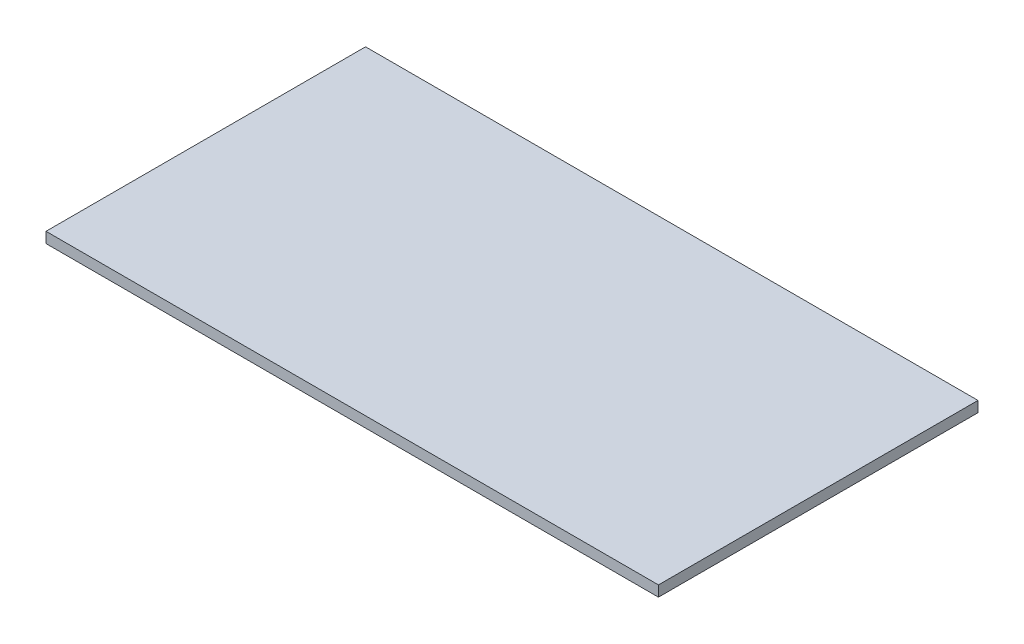
ISO-10303-21;
HEADER;
FILE_DESCRIPTION(('STEP AP214'),'2;1');
FILE_NAME('part.step','',(''),(''),'','','');
FILE_SCHEMA(('AUTOMOTIVE_DESIGN { 1 0 10303 214 1 1 1 1 }'));
ENDSEC;
DATA;
#1=APPLICATION_CONTEXT('core data for automotive mechanical design processes');
#2=APPLICATION_PROTOCOL_DEFINITION('international standard','automotive_design',2000,#1);
#3=PRODUCT_CONTEXT('',#1,'mechanical');
#4=PRODUCT('Part','Part','',(#3));
#5=PRODUCT_RELATED_PRODUCT_CATEGORY('part','',(#4));
#6=PRODUCT_DEFINITION_FORMATION('','',#4);
#7=PRODUCT_DEFINITION_CONTEXT('part definition',#1,'design');
#8=PRODUCT_DEFINITION('design','',#6,#7);
#9=PRODUCT_DEFINITION_SHAPE('','',#8);
#10=(LENGTH_UNIT() NAMED_UNIT(*) SI_UNIT(.MILLI.,.METRE.));
#11=(NAMED_UNIT(*) PLANE_ANGLE_UNIT() SI_UNIT($,.RADIAN.));
#12=(NAMED_UNIT(*) SI_UNIT($,.STERADIAN.) SOLID_ANGLE_UNIT());
#13=UNCERTAINTY_MEASURE_WITH_UNIT(LENGTH_MEASURE(1.E-05),#10,'distance_accuracy_value','');
#14=(GEOMETRIC_REPRESENTATION_CONTEXT(3) GLOBAL_UNCERTAINTY_ASSIGNED_CONTEXT((#13)) GLOBAL_UNIT_ASSIGNED_CONTEXT((#10,
#11,#12)) REPRESENTATION_CONTEXT('',''));
#15=CARTESIAN_POINT('',(0.,0.,0.));
#16=DIRECTION('',(0.,0.,1.));
#17=DIRECTION('',(1.,0.,0.));
#18=AXIS2_PLACEMENT_3D('',#15,#16,#17);
#19=CARTESIAN_POINT('',(575.,20.,-300.));
#20=DIRECTION('',(-1.,0.,0.));
#21=DIRECTION('',(0.,0.,1.));
#22=AXIS2_PLACEMENT_3D('',#19,#20,#21);
#23=PLANE('',#22);
#24=DIRECTION('',(0.,0.,-1.));
#25=VECTOR('',#24,1.);
#26=CARTESIAN_POINT('',(575.,0.,-300.));
#27=LINE('',#26,#25);
#28=CARTESIAN_POINT('',(575.,0.,300.));
#29=VERTEX_POINT('',#28);
#30=CARTESIAN_POINT('',(575.,0.,-300.));
#31=VERTEX_POINT('',#30);
#32=EDGE_CURVE('E95',#29,#31,#27,.T.);
#33=ORIENTED_EDGE('',*,*,#32,.T.);
#34=DIRECTION('',(0.,-1.,0.));
#35=VECTOR('',#34,1.);
#36=CARTESIAN_POINT('',(575.,20.,-300.));
#37=LINE('',#36,#35);
#38=CARTESIAN_POINT('',(575.,20.,-300.));
#39=VERTEX_POINT('',#38);
#40=EDGE_CURVE('E11',#39,#31,#37,.T.);
#41=ORIENTED_EDGE('',*,*,#40,.F.);
#42=DIRECTION('',(0.,0.,-1.));
#43=VECTOR('',#42,1.);
#44=CARTESIAN_POINT('',(575.,20.,-300.));
#45=LINE('',#44,#43);
#46=CARTESIAN_POINT('',(575.,20.,300.));
#47=VERTEX_POINT('',#46);
#48=EDGE_CURVE('E83',#47,#39,#45,.T.);
#49=ORIENTED_EDGE('',*,*,#48,.F.);
#50=DIRECTION('',(0.,-1.,0.));
#51=VECTOR('',#50,1.);
#52=CARTESIAN_POINT('',(575.,20.,300.));
#53=LINE('',#52,#51);
#54=EDGE_CURVE('E91',#47,#29,#53,.T.);
#55=ORIENTED_EDGE('',*,*,#54,.T.);
#56=EDGE_LOOP('',(#33,#41,#49,#55));
#57=FACE_BOUND('',#56,.T.);
#58=ADVANCED_FACE('F32',(#57),#23,.F.);
#59=CARTESIAN_POINT('',(-575.,20.,-300.));
#60=DIRECTION('',(0.,0.,1.));
#61=DIRECTION('',(1.,0.,0.));
#62=AXIS2_PLACEMENT_3D('',#59,#60,#61);
#63=PLANE('',#62);
#64=DIRECTION('',(-1.,0.,0.));
#65=VECTOR('',#64,1.);
#66=CARTESIAN_POINT('',(-575.,0.,-300.));
#67=LINE('',#66,#65);
#68=CARTESIAN_POINT('',(-575.,0.,-300.));
#69=VERTEX_POINT('',#68);
#70=EDGE_CURVE('E87',#31,#69,#67,.T.);
#71=ORIENTED_EDGE('',*,*,#70,.T.);
#72=DIRECTION('',(0.,-1.,0.));
#73=VECTOR('',#72,1.);
#74=CARTESIAN_POINT('',(-575.,20.,-300.));
#75=LINE('',#74,#73);
#76=CARTESIAN_POINT('',(-575.,20.,-300.));
#77=VERTEX_POINT('',#76);
#78=EDGE_CURVE('E40',#77,#69,#75,.T.);
#79=ORIENTED_EDGE('',*,*,#78,.F.);
#80=DIRECTION('',(-1.,0.,0.));
#81=VECTOR('',#80,1.);
#82=CARTESIAN_POINT('',(-575.,20.,-300.));
#83=LINE('',#82,#81);
#84=EDGE_CURVE('E78',#39,#77,#83,.T.);
#85=ORIENTED_EDGE('',*,*,#84,.F.);
#86=ORIENTED_EDGE('',*,*,#40,.T.);
#87=EDGE_LOOP('',(#71,#79,#85,#86));
#88=FACE_BOUND('',#87,.T.);
#89=ADVANCED_FACE('F86',(#88),#63,.F.);
#90=CARTESIAN_POINT('',(-575.,20.,-300.));
#91=DIRECTION('',(1.,0.,0.));
#92=DIRECTION('',(0.,0.,-1.));
#93=AXIS2_PLACEMENT_3D('',#90,#91,#92);
#94=PLANE('',#93);
#95=DIRECTION('',(0.,0.,1.));
#96=VECTOR('',#95,1.);
#97=CARTESIAN_POINT('',(-575.,0.,-300.));
#98=LINE('',#97,#96);
#99=CARTESIAN_POINT('',(-575.,0.,300.));
#100=VERTEX_POINT('',#99);
#101=EDGE_CURVE('E65',#69,#100,#98,.T.);
#102=ORIENTED_EDGE('',*,*,#101,.T.);
#103=DIRECTION('',(0.,-1.,0.));
#104=VECTOR('',#103,1.);
#105=CARTESIAN_POINT('',(-575.,20.,300.));
#106=LINE('',#105,#104);
#107=CARTESIAN_POINT('',(-575.,20.,300.));
#108=VERTEX_POINT('',#107);
#109=EDGE_CURVE('E88',#108,#100,#106,.T.);
#110=ORIENTED_EDGE('',*,*,#109,.F.);
#111=DIRECTION('',(0.,0.,1.));
#112=VECTOR('',#111,1.);
#113=CARTESIAN_POINT('',(-575.,20.,-300.));
#114=LINE('',#113,#112);
#115=EDGE_CURVE('E81',#77,#108,#114,.T.);
#116=ORIENTED_EDGE('',*,*,#115,.F.);
#117=ORIENTED_EDGE('',*,*,#78,.T.);
#118=EDGE_LOOP('',(#102,#110,#116,#117));
#119=FACE_BOUND('',#118,.T.);
#120=ADVANCED_FACE('F89',(#119),#94,.F.);
#121=CARTESIAN_POINT('',(-575.,20.,300.));
#122=DIRECTION('',(0.,0.,-1.));
#123=DIRECTION('',(-1.,0.,0.));
#124=AXIS2_PLACEMENT_3D('',#121,#122,#123);
#125=PLANE('',#124);
#126=DIRECTION('',(1.,0.,0.));
#127=VECTOR('',#126,1.);
#128=CARTESIAN_POINT('',(-575.,0.,300.));
#129=LINE('',#128,#127);
#130=EDGE_CURVE('E71',#100,#29,#129,.T.);
#131=ORIENTED_EDGE('',*,*,#130,.T.);
#132=ORIENTED_EDGE('',*,*,#54,.F.);
#133=DIRECTION('',(1.,0.,0.));
#134=VECTOR('',#133,1.);
#135=CARTESIAN_POINT('',(-575.,20.,300.));
#136=LINE('',#135,#134);
#137=EDGE_CURVE('E48',#108,#47,#136,.T.);
#138=ORIENTED_EDGE('',*,*,#137,.F.);
#139=ORIENTED_EDGE('',*,*,#109,.T.);
#140=EDGE_LOOP('',(#131,#132,#138,#139));
#141=FACE_BOUND('',#140,.T.);
#142=ADVANCED_FACE('F102',(#141),#125,.F.);
#143=CARTESIAN_POINT('',(0.,20.,0.));
#144=DIRECTION('',(0.,1.,0.));
#145=DIRECTION('',(0.,0.,1.));
#146=AXIS2_PLACEMENT_3D('',#143,#144,#145);
#147=PLANE('',#146);
#148=ORIENTED_EDGE('',*,*,#48,.T.);
#149=ORIENTED_EDGE('',*,*,#84,.T.);
#150=ORIENTED_EDGE('',*,*,#115,.T.);
#151=ORIENTED_EDGE('',*,*,#137,.T.);
#152=EDGE_LOOP('',(#148,#149,#150,#151));
#153=FACE_BOUND('',#152,.T.);
#154=ADVANCED_FACE('F79',(#153),#147,.T.);
#155=CARTESIAN_POINT('',(0.,0.,0.));
#156=DIRECTION('',(0.,1.,0.));
#157=DIRECTION('',(0.,0.,1.));
#158=AXIS2_PLACEMENT_3D('',#155,#156,#157);
#159=PLANE('',#158);
#160=ORIENTED_EDGE('',*,*,#32,.F.);
#161=ORIENTED_EDGE('',*,*,#130,.F.);
#162=ORIENTED_EDGE('',*,*,#101,.F.);
#163=ORIENTED_EDGE('',*,*,#70,.F.);
#164=EDGE_LOOP('',(#160,#161,#162,#163));
#165=FACE_BOUND('',#164,.T.);
#166=ADVANCED_FACE('F105',(#165),#159,.F.);
#167=CLOSED_SHELL('',(#58,#89,#120,#142,#154,#166));
#168=MANIFOLD_SOLID_BREP('B2',#167);
#169=ADVANCED_BREP_SHAPE_REPRESENTATION('',(#18,#168),#14);
#170=SHAPE_DEFINITION_REPRESENTATION(#9,#169);
ENDSEC;
END-ISO-10303-21;
